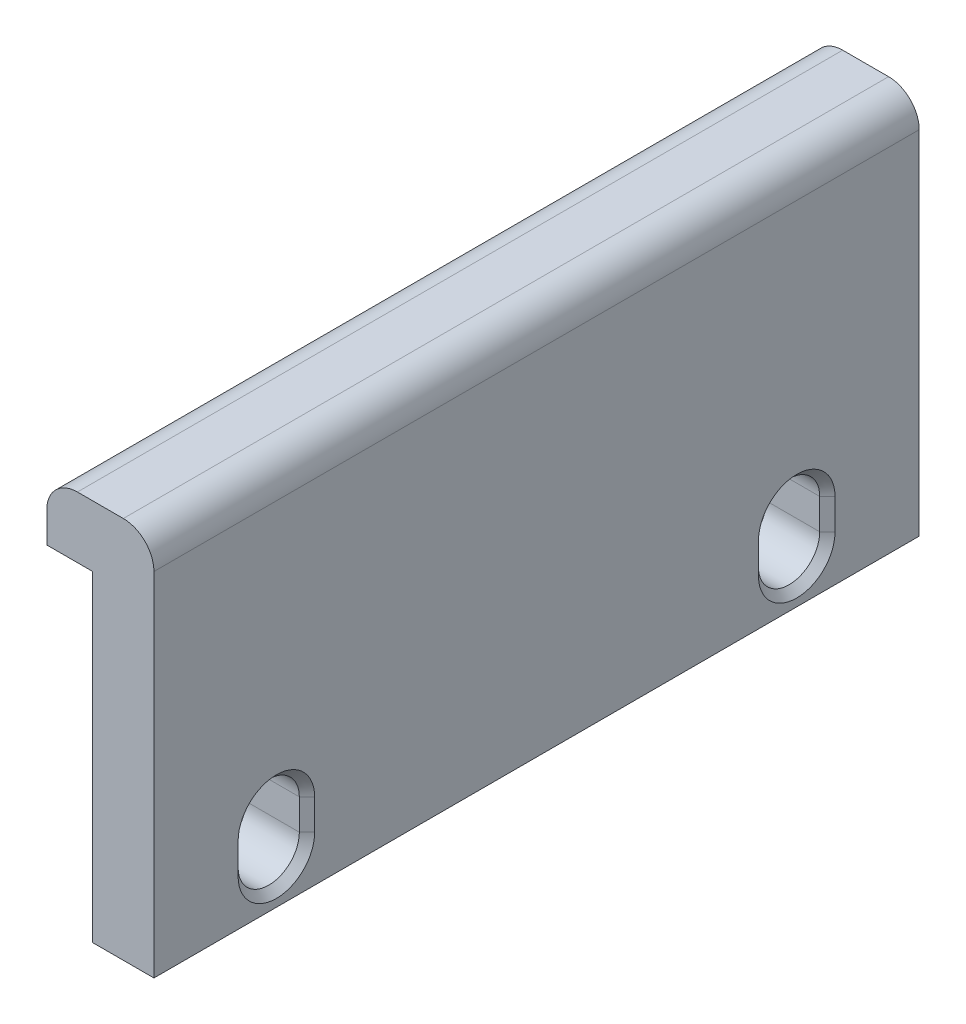
ISO-10303-21;
HEADER;
FILE_DESCRIPTION(('STEP AP214'),'2;1');
FILE_NAME('part.step','',(''),(''),'','','');
FILE_SCHEMA(('AUTOMOTIVE_DESIGN { 1 0 10303 214 1 1 1 1 }'));
ENDSEC;
DATA;
#1=APPLICATION_CONTEXT('core data for automotive mechanical design processes');
#2=APPLICATION_PROTOCOL_DEFINITION('international standard','automotive_design',2000,#1);
#3=PRODUCT_CONTEXT('',#1,'mechanical');
#4=PRODUCT('Part','Part','',(#3));
#5=PRODUCT_RELATED_PRODUCT_CATEGORY('part','',(#4));
#6=PRODUCT_DEFINITION_FORMATION('','',#4);
#7=PRODUCT_DEFINITION_CONTEXT('part definition',#1,'design');
#8=PRODUCT_DEFINITION('design','',#6,#7);
#9=PRODUCT_DEFINITION_SHAPE('','',#8);
#10=(LENGTH_UNIT() NAMED_UNIT(*) SI_UNIT(.MILLI.,.METRE.));
#11=(NAMED_UNIT(*) PLANE_ANGLE_UNIT() SI_UNIT($,.RADIAN.));
#12=(NAMED_UNIT(*) SI_UNIT($,.STERADIAN.) SOLID_ANGLE_UNIT());
#13=UNCERTAINTY_MEASURE_WITH_UNIT(LENGTH_MEASURE(1.E-05),#10,'distance_accuracy_value','');
#14=(GEOMETRIC_REPRESENTATION_CONTEXT(3) GLOBAL_UNCERTAINTY_ASSIGNED_CONTEXT((#13)) GLOBAL_UNIT_ASSIGNED_CONTEXT((#10,
#11,#12)) REPRESENTATION_CONTEXT('',''));
#15=CARTESIAN_POINT('',(0.,0.,0.));
#16=DIRECTION('',(0.,0.,1.));
#17=DIRECTION('',(1.,0.,0.));
#18=AXIS2_PLACEMENT_3D('',#15,#16,#17);
#19=CARTESIAN_POINT('',(4.,0.,50.));
#20=DIRECTION('',(-1.,0.,0.));
#21=DIRECTION('',(0.,0.,1.));
#22=AXIS2_PLACEMENT_3D('',#19,#20,#21);
#23=PLANE('',#22);
#24=DIRECTION('',(0.,1.,0.));
#25=VECTOR('',#24,1.);
#26=CARTESIAN_POINT('',(4.,5.,10.5));
#27=LINE('',#26,#25);
#28=CARTESIAN_POINT('',(4.,3.,10.5));
#29=VERTEX_POINT('',#28);
#30=CARTESIAN_POINT('',(4.,5.,10.5));
#31=VERTEX_POINT('',#30);
#32=EDGE_CURVE('E304',#29,#31,#27,.T.);
#33=ORIENTED_EDGE('',*,*,#32,.T.);
#34=CARTESIAN_POINT('',(4.,5.00000000000001,8.));
#35=DIRECTION('',(-1.,0.,0.));
#36=DIRECTION('',(0.,0.,1.));
#37=AXIS2_PLACEMENT_3D('',#34,#35,#36);
#38=CIRCLE('',#37,2.5);
#39=CARTESIAN_POINT('',(4.,5.,5.5));
#40=VERTEX_POINT('',#39);
#41=EDGE_CURVE('E308',#31,#40,#38,.T.);
#42=ORIENTED_EDGE('',*,*,#41,.T.);
#43=DIRECTION('',(0.,-1.,0.));
#44=VECTOR('',#43,1.);
#45=CARTESIAN_POINT('',(4.,0.,5.5));
#46=LINE('',#45,#44);
#47=CARTESIAN_POINT('',(4.,3.,5.5));
#48=VERTEX_POINT('',#47);
#49=EDGE_CURVE('E306',#40,#48,#46,.T.);
#50=ORIENTED_EDGE('',*,*,#49,.T.);
#51=CARTESIAN_POINT('',(4.,3.,8.));
#52=DIRECTION('',(-1.,0.,0.));
#53=DIRECTION('',(0.,0.,1.));
#54=AXIS2_PLACEMENT_3D('',#51,#52,#53);
#55=CIRCLE('',#54,2.5);
#56=EDGE_CURVE('E302',#48,#29,#55,.T.);
#57=ORIENTED_EDGE('',*,*,#56,.T.);
#58=EDGE_LOOP('',(#33,#42,#50,#57));
#59=FACE_BOUND('',#58,.T.);
#60=DIRECTION('',(0.,1.,0.));
#61=VECTOR('',#60,1.);
#62=CARTESIAN_POINT('',(4.,5.,44.5));
#63=LINE('',#62,#61);
#64=CARTESIAN_POINT('',(4.,3.,44.5));
#65=VERTEX_POINT('',#64);
#66=CARTESIAN_POINT('',(4.,4.99999999999999,44.5));
#67=VERTEX_POINT('',#66);
#68=EDGE_CURVE('E297',#65,#67,#63,.T.);
#69=ORIENTED_EDGE('',*,*,#68,.T.);
#70=CARTESIAN_POINT('',(4.,5.,42.));
#71=DIRECTION('',(-1.,0.,0.));
#72=DIRECTION('',(0.,0.,1.));
#73=AXIS2_PLACEMENT_3D('',#70,#71,#72);
#74=CIRCLE('',#73,2.5);
#75=CARTESIAN_POINT('',(4.,4.99999999999999,39.5));
#76=VERTEX_POINT('',#75);
#77=EDGE_CURVE('E299',#67,#76,#74,.T.);
#78=ORIENTED_EDGE('',*,*,#77,.T.);
#79=DIRECTION('',(0.,-1.,0.));
#80=VECTOR('',#79,1.);
#81=CARTESIAN_POINT('',(4.,0.,39.5));
#82=LINE('',#81,#80);
#83=CARTESIAN_POINT('',(4.,3.,39.5));
#84=VERTEX_POINT('',#83);
#85=EDGE_CURVE('E295',#76,#84,#82,.T.);
#86=ORIENTED_EDGE('',*,*,#85,.T.);
#87=CARTESIAN_POINT('',(4.,2.99999999999999,42.));
#88=DIRECTION('',(-1.,0.,0.));
#89=DIRECTION('',(0.,0.,1.));
#90=AXIS2_PLACEMENT_3D('',#87,#88,#89);
#91=CIRCLE('',#90,2.5);
#92=EDGE_CURVE('E293',#84,#65,#91,.T.);
#93=ORIENTED_EDGE('',*,*,#92,.T.);
#94=EDGE_LOOP('',(#69,#78,#86,#93));
#95=FACE_BOUND('',#94,.T.);
#96=DIRECTION('',(0.,1.,0.));
#97=VECTOR('',#96,1.);
#98=CARTESIAN_POINT('',(4.,0.,0.));
#99=LINE('',#98,#97);
#100=CARTESIAN_POINT('',(4.,0.,0.));
#101=VERTEX_POINT('',#100);
#102=CARTESIAN_POINT('',(4.,23.,0.));
#103=VERTEX_POINT('',#102);
#104=EDGE_CURVE('E253',#101,#103,#99,.T.);
#105=ORIENTED_EDGE('',*,*,#104,.T.);
#106=DIRECTION('',(0.,0.,-1.));
#107=VECTOR('',#106,1.);
#108=CARTESIAN_POINT('',(4.,23.,50.));
#109=LINE('',#108,#107);
#110=CARTESIAN_POINT('',(4.,23.,50.));
#111=VERTEX_POINT('',#110);
#112=EDGE_CURVE('E291',#103,#111,#109,.F.);
#113=ORIENTED_EDGE('',*,*,#112,.T.);
#114=DIRECTION('',(0.,1.,0.));
#115=VECTOR('',#114,1.);
#116=CARTESIAN_POINT('',(4.,0.,50.));
#117=LINE('',#116,#115);
#118=CARTESIAN_POINT('',(4.,0.,50.));
#119=VERTEX_POINT('',#118);
#120=EDGE_CURVE('E237',#119,#111,#117,.T.);
#121=ORIENTED_EDGE('',*,*,#120,.F.);
#122=DIRECTION('',(0.,0.,-1.));
#123=VECTOR('',#122,1.);
#124=CARTESIAN_POINT('',(4.,0.,50.));
#125=LINE('',#124,#123);
#126=EDGE_CURVE('E272',#119,#101,#125,.T.);
#127=ORIENTED_EDGE('',*,*,#126,.T.);
#128=EDGE_LOOP('',(#105,#113,#121,#127));
#129=FACE_BOUND('',#128,.T.);
#130=ADVANCED_FACE('F37',(#59,#95,#129),#23,.F.);
#131=CARTESIAN_POINT('',(0.,21.,50.));
#132=DIRECTION('',(1.,0.,0.));
#133=DIRECTION('',(0.,1.,0.));
#134=AXIS2_PLACEMENT_3D('',#131,#132,#133);
#135=PLANE('',#134);
#136=CARTESIAN_POINT('',(0.,2.99999999999999,42.));
#137=DIRECTION('',(1.,0.,0.));
#138=DIRECTION('',(0.,1.,0.));
#139=AXIS2_PLACEMENT_3D('',#136,#137,#138);
#140=CIRCLE('',#139,2.00000000000001);
#141=CARTESIAN_POINT('',(0.,3.,40.));
#142=VERTEX_POINT('',#141);
#143=CARTESIAN_POINT('',(0.,3.,44.));
#144=VERTEX_POINT('',#143);
#145=EDGE_CURVE('E200',#142,#144,#140,.F.);
#146=ORIENTED_EDGE('',*,*,#145,.F.);
#147=DIRECTION('',(0.,-1.,0.));
#148=VECTOR('',#147,1.);
#149=CARTESIAN_POINT('',(0.,0.,40.));
#150=LINE('',#149,#148);
#151=CARTESIAN_POINT('',(0.,4.99999999999999,40.));
#152=VERTEX_POINT('',#151);
#153=EDGE_CURVE('E180',#152,#142,#150,.T.);
#154=ORIENTED_EDGE('',*,*,#153,.F.);
#155=CARTESIAN_POINT('',(0.,5.,42.));
#156=DIRECTION('',(1.,0.,0.));
#157=DIRECTION('',(0.,1.,0.));
#158=AXIS2_PLACEMENT_3D('',#155,#156,#157);
#159=CIRCLE('',#158,2.00000000000001);
#160=CARTESIAN_POINT('',(0.,4.99999999999999,44.));
#161=VERTEX_POINT('',#160);
#162=EDGE_CURVE('E190',#161,#152,#159,.F.);
#163=ORIENTED_EDGE('',*,*,#162,.F.);
#164=DIRECTION('',(0.,-1.,0.));
#165=VECTOR('',#164,1.);
#166=CARTESIAN_POINT('',(0.,0.,44.));
#167=LINE('',#166,#165);
#168=EDGE_CURVE('E202',#161,#144,#167,.T.);
#169=ORIENTED_EDGE('',*,*,#168,.T.);
#170=EDGE_LOOP('',(#146,#154,#163,#169));
#171=FACE_BOUND('',#170,.T.);
#172=DIRECTION('',(0.,-1.,0.));
#173=VECTOR('',#172,1.);
#174=CARTESIAN_POINT('',(0.,21.,0.));
#175=LINE('',#174,#173);
#176=CARTESIAN_POINT('',(0.,21.,0.));
#177=VERTEX_POINT('',#176);
#178=CARTESIAN_POINT('',(0.,0.,0.));
#179=VERTEX_POINT('',#178);
#180=EDGE_CURVE('E238',#177,#179,#175,.T.);
#181=ORIENTED_EDGE('',*,*,#180,.T.);
#182=DIRECTION('',(0.,0.,-1.));
#183=VECTOR('',#182,1.);
#184=CARTESIAN_POINT('',(0.,0.,50.));
#185=LINE('',#184,#183);
#186=CARTESIAN_POINT('',(0.,0.,50.));
#187=VERTEX_POINT('',#186);
#188=EDGE_CURVE('E250',#187,#179,#185,.T.);
#189=ORIENTED_EDGE('',*,*,#188,.F.);
#190=DIRECTION('',(0.,-1.,0.));
#191=VECTOR('',#190,1.);
#192=CARTESIAN_POINT('',(0.,21.,50.));
#193=LINE('',#192,#191);
#194=CARTESIAN_POINT('',(0.,21.,50.));
#195=VERTEX_POINT('',#194);
#196=EDGE_CURVE('E248',#195,#187,#193,.T.);
#197=ORIENTED_EDGE('',*,*,#196,.F.);
#198=DIRECTION('',(0.,0.,-1.));
#199=VECTOR('',#198,1.);
#200=CARTESIAN_POINT('',(0.,21.,50.));
#201=LINE('',#200,#199);
#202=EDGE_CURVE('E266',#195,#177,#201,.T.);
#203=ORIENTED_EDGE('',*,*,#202,.T.);
#204=EDGE_LOOP('',(#181,#189,#197,#203));
#205=FACE_BOUND('',#204,.T.);
#206=CARTESIAN_POINT('',(0.,5.00000000000001,8.));
#207=DIRECTION('',(1.,0.,0.));
#208=DIRECTION('',(0.,1.,0.));
#209=AXIS2_PLACEMENT_3D('',#206,#207,#208);
#210=CIRCLE('',#209,2.);
#211=CARTESIAN_POINT('',(0.,5.,6.));
#212=VERTEX_POINT('',#211);
#213=CARTESIAN_POINT('',(0.,5.,10.));
#214=VERTEX_POINT('',#213);
#215=EDGE_CURVE('E216',#212,#214,#210,.T.);
#216=ORIENTED_EDGE('',*,*,#215,.T.);
#217=DIRECTION('',(0.,-1.,0.));
#218=VECTOR('',#217,1.);
#219=CARTESIAN_POINT('',(0.,0.,10.));
#220=LINE('',#219,#218);
#221=CARTESIAN_POINT('',(0.,3.,10.));
#222=VERTEX_POINT('',#221);
#223=EDGE_CURVE('E223',#214,#222,#220,.T.);
#224=ORIENTED_EDGE('',*,*,#223,.T.);
#225=CARTESIAN_POINT('',(0.,3.,8.));
#226=DIRECTION('',(1.,0.,0.));
#227=DIRECTION('',(0.,1.,0.));
#228=AXIS2_PLACEMENT_3D('',#225,#226,#227);
#229=CIRCLE('',#228,2.);
#230=CARTESIAN_POINT('',(0.,3.,6.));
#231=VERTEX_POINT('',#230);
#232=EDGE_CURVE('E210',#222,#231,#229,.T.);
#233=ORIENTED_EDGE('',*,*,#232,.T.);
#234=DIRECTION('',(0.,-1.,0.));
#235=VECTOR('',#234,1.);
#236=CARTESIAN_POINT('',(0.,0.,6.));
#237=LINE('',#236,#235);
#238=EDGE_CURVE('E213',#212,#231,#237,.T.);
#239=ORIENTED_EDGE('',*,*,#238,.F.);
#240=EDGE_LOOP('',(#216,#224,#233,#239));
#241=FACE_BOUND('',#240,.T.);
#242=ADVANCED_FACE('F197',(#171,#205,#241),#135,.F.);
#243=CARTESIAN_POINT('',(0.,0.,50.));
#244=DIRECTION('',(0.,1.,0.));
#245=DIRECTION('',(0.,0.,1.));
#246=AXIS2_PLACEMENT_3D('',#243,#244,#245);
#247=PLANE('',#246);
#248=DIRECTION('',(1.,0.,0.));
#249=VECTOR('',#248,1.);
#250=CARTESIAN_POINT('',(0.,0.,0.));
#251=LINE('',#250,#249);
#252=EDGE_CURVE('E194',#179,#101,#251,.T.);
#253=ORIENTED_EDGE('',*,*,#252,.T.);
#254=ORIENTED_EDGE('',*,*,#126,.F.);
#255=DIRECTION('',(1.,0.,0.));
#256=VECTOR('',#255,1.);
#257=CARTESIAN_POINT('',(0.,0.,50.));
#258=LINE('',#257,#256);
#259=EDGE_CURVE('E234',#187,#119,#258,.T.);
#260=ORIENTED_EDGE('',*,*,#259,.F.);
#261=ORIENTED_EDGE('',*,*,#188,.T.);
#262=EDGE_LOOP('',(#253,#254,#260,#261));
#263=FACE_BOUND('',#262,.T.);
#264=ADVANCED_FACE('F373',(#263),#247,.F.);
#265=CARTESIAN_POINT('',(4.,25.,50.));
#266=DIRECTION('',(0.,-1.,0.));
#267=DIRECTION('',(0.,0.,-1.));
#268=AXIS2_PLACEMENT_3D('',#265,#266,#267);
#269=PLANE('',#268);
#270=DIRECTION('',(-1.,0.,0.));
#271=VECTOR('',#270,1.);
#272=CARTESIAN_POINT('',(4.,25.,0.));
#273=LINE('',#272,#271);
#274=CARTESIAN_POINT('',(2.,25.,0.));
#275=VERTEX_POINT('',#274);
#276=CARTESIAN_POINT('',(-1.,25.,0.));
#277=VERTEX_POINT('',#276);
#278=EDGE_CURVE('E256',#275,#277,#273,.T.);
#279=ORIENTED_EDGE('',*,*,#278,.T.);
#280=DIRECTION('',(0.,0.,-1.));
#281=VECTOR('',#280,1.);
#282=CARTESIAN_POINT('',(-1.,25.,50.));
#283=LINE('',#282,#281);
#284=CARTESIAN_POINT('',(-1.,25.,50.));
#285=VERTEX_POINT('',#284);
#286=EDGE_CURVE('E285',#277,#285,#283,.F.);
#287=ORIENTED_EDGE('',*,*,#286,.T.);
#288=DIRECTION('',(-1.,0.,0.));
#289=VECTOR('',#288,1.);
#290=CARTESIAN_POINT('',(4.,25.,50.));
#291=LINE('',#290,#289);
#292=CARTESIAN_POINT('',(2.,25.,50.));
#293=VERTEX_POINT('',#292);
#294=EDGE_CURVE('E241',#293,#285,#291,.T.);
#295=ORIENTED_EDGE('',*,*,#294,.F.);
#296=DIRECTION('',(0.,0.,-1.));
#297=VECTOR('',#296,1.);
#298=CARTESIAN_POINT('',(2.,25.,50.));
#299=LINE('',#298,#297);
#300=EDGE_CURVE('E282',#293,#275,#299,.T.);
#301=ORIENTED_EDGE('',*,*,#300,.T.);
#302=EDGE_LOOP('',(#279,#287,#295,#301));
#303=FACE_BOUND('',#302,.T.);
#304=ADVANCED_FACE('F377',(#303),#269,.F.);
#305=CARTESIAN_POINT('',(-3.,25.,50.));
#306=DIRECTION('',(1.,0.,0.));
#307=DIRECTION('',(0.,1.,0.));
#308=AXIS2_PLACEMENT_3D('',#305,#306,#307);
#309=PLANE('',#308);
#310=DIRECTION('',(0.,-1.,0.));
#311=VECTOR('',#310,1.);
#312=CARTESIAN_POINT('',(-3.,25.,50.));
#313=LINE('',#312,#311);
#314=CARTESIAN_POINT('',(-3.,23.,50.));
#315=VERTEX_POINT('',#314);
#316=CARTESIAN_POINT('',(-3.,21.,50.));
#317=VERTEX_POINT('',#316);
#318=EDGE_CURVE('E244',#315,#317,#313,.T.);
#319=ORIENTED_EDGE('',*,*,#318,.F.);
#320=DIRECTION('',(0.,0.,-1.));
#321=VECTOR('',#320,1.);
#322=CARTESIAN_POINT('',(-3.,23.,50.));
#323=LINE('',#322,#321);
#324=CARTESIAN_POINT('',(-3.,23.,0.));
#325=VERTEX_POINT('',#324);
#326=EDGE_CURVE('E275',#315,#325,#323,.T.);
#327=ORIENTED_EDGE('',*,*,#326,.T.);
#328=DIRECTION('',(0.,-1.,0.));
#329=VECTOR('',#328,1.);
#330=CARTESIAN_POINT('',(-3.,25.,0.));
#331=LINE('',#330,#329);
#332=CARTESIAN_POINT('',(-3.,21.,0.));
#333=VERTEX_POINT('',#332);
#334=EDGE_CURVE('E259',#325,#333,#331,.T.);
#335=ORIENTED_EDGE('',*,*,#334,.T.);
#336=DIRECTION('',(0.,0.,-1.));
#337=VECTOR('',#336,1.);
#338=CARTESIAN_POINT('',(-3.,21.,50.));
#339=LINE('',#338,#337);
#340=EDGE_CURVE('E269',#317,#333,#339,.T.);
#341=ORIENTED_EDGE('',*,*,#340,.F.);
#342=EDGE_LOOP('',(#319,#327,#335,#341));
#343=FACE_BOUND('',#342,.T.);
#344=ADVANCED_FACE('F561',(#343),#309,.F.);
#345=CARTESIAN_POINT('',(-3.,21.,50.));
#346=DIRECTION('',(0.,1.,0.));
#347=DIRECTION('',(-1.,0.,0.));
#348=AXIS2_PLACEMENT_3D('',#345,#346,#347);
#349=PLANE('',#348);
#350=DIRECTION('',(1.,0.,0.));
#351=VECTOR('',#350,1.);
#352=CARTESIAN_POINT('',(-3.,21.,0.));
#353=LINE('',#352,#351);
#354=EDGE_CURVE('E261',#333,#177,#353,.T.);
#355=ORIENTED_EDGE('',*,*,#354,.T.);
#356=ORIENTED_EDGE('',*,*,#202,.F.);
#357=DIRECTION('',(1.,0.,0.));
#358=VECTOR('',#357,1.);
#359=CARTESIAN_POINT('',(-3.,21.,50.));
#360=LINE('',#359,#358);
#361=EDGE_CURVE('E246',#317,#195,#360,.T.);
#362=ORIENTED_EDGE('',*,*,#361,.F.);
#363=ORIENTED_EDGE('',*,*,#340,.T.);
#364=EDGE_LOOP('',(#355,#356,#362,#363));
#365=FACE_BOUND('',#364,.T.);
#366=ADVANCED_FACE('F553',(#365),#349,.F.);
#367=CARTESIAN_POINT('',(0.,0.,50.));
#368=DIRECTION('',(0.,0.,1.));
#369=DIRECTION('',(1.,0.,0.));
#370=AXIS2_PLACEMENT_3D('',#367,#368,#369);
#371=PLANE('',#370);
#372=ORIENTED_EDGE('',*,*,#294,.T.);
#373=CARTESIAN_POINT('',(-1.,23.,50.));
#374=DIRECTION('',(0.,0.,1.));
#375=DIRECTION('',(1.,0.,0.));
#376=AXIS2_PLACEMENT_3D('',#373,#374,#375);
#377=CIRCLE('',#376,2.);
#378=EDGE_CURVE('E289',#285,#315,#377,.T.);
#379=ORIENTED_EDGE('',*,*,#378,.T.);
#380=ORIENTED_EDGE('',*,*,#318,.T.);
#381=ORIENTED_EDGE('',*,*,#361,.T.);
#382=ORIENTED_EDGE('',*,*,#196,.T.);
#383=ORIENTED_EDGE('',*,*,#259,.T.);
#384=ORIENTED_EDGE('',*,*,#120,.T.);
#385=CARTESIAN_POINT('',(2.,23.,50.));
#386=DIRECTION('',(0.,0.,1.));
#387=DIRECTION('',(1.,0.,0.));
#388=AXIS2_PLACEMENT_3D('',#385,#386,#387);
#389=CIRCLE('',#388,2.);
#390=EDGE_CURVE('E287',#111,#293,#389,.T.);
#391=ORIENTED_EDGE('',*,*,#390,.T.);
#392=EDGE_LOOP('',(#372,#379,#380,#381,#382,#383,#384,#391));
#393=FACE_BOUND('',#392,.T.);
#394=ADVANCED_FACE('F543',(#393),#371,.T.);
#395=CARTESIAN_POINT('',(0.,0.,0.));
#396=DIRECTION('',(0.,0.,1.));
#397=DIRECTION('',(1.,0.,0.));
#398=AXIS2_PLACEMENT_3D('',#395,#396,#397);
#399=PLANE('',#398);
#400=ORIENTED_EDGE('',*,*,#334,.F.);
#401=CARTESIAN_POINT('',(-1.,23.,0.));
#402=DIRECTION('',(0.,0.,1.));
#403=DIRECTION('',(1.,0.,0.));
#404=AXIS2_PLACEMENT_3D('',#401,#402,#403);
#405=CIRCLE('',#404,2.);
#406=EDGE_CURVE('E280',#325,#277,#405,.F.);
#407=ORIENTED_EDGE('',*,*,#406,.T.);
#408=ORIENTED_EDGE('',*,*,#278,.F.);
#409=CARTESIAN_POINT('',(2.,23.,0.));
#410=DIRECTION('',(0.,0.,1.));
#411=DIRECTION('',(1.,0.,0.));
#412=AXIS2_PLACEMENT_3D('',#409,#410,#411);
#413=CIRCLE('',#412,2.);
#414=EDGE_CURVE('E278',#275,#103,#413,.F.);
#415=ORIENTED_EDGE('',*,*,#414,.T.);
#416=ORIENTED_EDGE('',*,*,#104,.F.);
#417=ORIENTED_EDGE('',*,*,#252,.F.);
#418=ORIENTED_EDGE('',*,*,#180,.F.);
#419=ORIENTED_EDGE('',*,*,#354,.F.);
#420=EDGE_LOOP('',(#400,#407,#408,#415,#416,#417,#418,#419));
#421=FACE_BOUND('',#420,.T.);
#422=ADVANCED_FACE('F386',(#421),#399,.F.);
#423=CARTESIAN_POINT('',(-1.,23.,50.));
#424=DIRECTION('',(0.,0.,-1.));
#425=DIRECTION('',(-1.,0.,0.));
#426=AXIS2_PLACEMENT_3D('',#423,#424,#425);
#427=CYLINDRICAL_SURFACE('',#426,2.);
#428=ORIENTED_EDGE('',*,*,#378,.F.);
#429=ORIENTED_EDGE('',*,*,#286,.F.);
#430=ORIENTED_EDGE('',*,*,#406,.F.);
#431=ORIENTED_EDGE('',*,*,#326,.F.);
#432=EDGE_LOOP('',(#428,#429,#430,#431));
#433=FACE_BOUND('',#432,.T.);
#434=ADVANCED_FACE('F382',(#433),#427,.T.);
#435=CARTESIAN_POINT('',(2.,23.,50.));
#436=DIRECTION('',(0.,0.,-1.));
#437=DIRECTION('',(-1.,0.,0.));
#438=AXIS2_PLACEMENT_3D('',#435,#436,#437);
#439=CYLINDRICAL_SURFACE('',#438,2.);
#440=ORIENTED_EDGE('',*,*,#390,.F.);
#441=ORIENTED_EDGE('',*,*,#112,.F.);
#442=ORIENTED_EDGE('',*,*,#414,.F.);
#443=ORIENTED_EDGE('',*,*,#300,.F.);
#444=EDGE_LOOP('',(#440,#441,#442,#443));
#445=FACE_BOUND('',#444,.T.);
#446=ADVANCED_FACE('F385',(#445),#439,.T.);
#447=CARTESIAN_POINT('',(-3.001,5.00000000000001,8.));
#448=DIRECTION('',(1.,0.,0.));
#449=DIRECTION('',(0.,1.,0.));
#450=AXIS2_PLACEMENT_3D('',#447,#448,#449);
#451=CYLINDRICAL_SURFACE('',#450,2.);
#452=DIRECTION('',(1.,0.,0.));
#453=VECTOR('',#452,1.);
#454=CARTESIAN_POINT('',(-3.001,5.,6.));
#455=LINE('',#454,#453);
#456=CARTESIAN_POINT('',(3.5,5.,6.));
#457=VERTEX_POINT('',#456);
#458=EDGE_CURVE('E220',#212,#457,#455,.T.);
#459=ORIENTED_EDGE('',*,*,#458,.T.);
#460=CARTESIAN_POINT('',(3.5,5.00000000000001,8.));
#461=DIRECTION('',(-1.,0.,0.));
#462=DIRECTION('',(0.,0.,1.));
#463=AXIS2_PLACEMENT_3D('',#460,#461,#462);
#464=CIRCLE('',#463,2.);
#465=CARTESIAN_POINT('',(3.5,5.,10.));
#466=VERTEX_POINT('',#465);
#467=EDGE_CURVE('E311',#457,#466,#464,.F.);
#468=ORIENTED_EDGE('',*,*,#467,.T.);
#469=DIRECTION('',(1.,0.,0.));
#470=VECTOR('',#469,1.);
#471=CARTESIAN_POINT('',(-3.001,5.,10.));
#472=LINE('',#471,#470);
#473=EDGE_CURVE('E219',#214,#466,#472,.T.);
#474=ORIENTED_EDGE('',*,*,#473,.F.);
#475=ORIENTED_EDGE('',*,*,#215,.F.);
#476=EDGE_LOOP('',(#459,#468,#474,#475));
#477=FACE_BOUND('',#476,.T.);
#478=ADVANCED_FACE('F390',(#477),#451,.F.);
#479=CARTESIAN_POINT('',(-3.001,0.,6.));
#480=DIRECTION('',(0.,0.,-1.));
#481=DIRECTION('',(-1.,0.,0.));
#482=AXIS2_PLACEMENT_3D('',#479,#480,#481);
#483=PLANE('',#482);
#484=DIRECTION('',(1.,0.,0.));
#485=VECTOR('',#484,1.);
#486=CARTESIAN_POINT('',(-3.001,3.,6.));
#487=LINE('',#486,#485);
#488=CARTESIAN_POINT('',(3.5,3.,6.));
#489=VERTEX_POINT('',#488);
#490=EDGE_CURVE('E224',#231,#489,#487,.T.);
#491=ORIENTED_EDGE('',*,*,#490,.T.);
#492=DIRECTION('',(0.,1.,0.));
#493=VECTOR('',#492,1.);
#494=CARTESIAN_POINT('',(3.5,0.,6.));
#495=LINE('',#494,#493);
#496=EDGE_CURVE('E314',#489,#457,#495,.T.);
#497=ORIENTED_EDGE('',*,*,#496,.T.);
#498=ORIENTED_EDGE('',*,*,#458,.F.);
#499=ORIENTED_EDGE('',*,*,#238,.T.);
#500=EDGE_LOOP('',(#491,#497,#498,#499));
#501=FACE_BOUND('',#500,.T.);
#502=ADVANCED_FACE('F493',(#501),#483,.F.);
#503=CARTESIAN_POINT('',(-3.001,3.,8.));
#504=DIRECTION('',(1.,0.,0.));
#505=DIRECTION('',(0.,1.,0.));
#506=AXIS2_PLACEMENT_3D('',#503,#504,#505);
#507=CYLINDRICAL_SURFACE('',#506,2.);
#508=DIRECTION('',(1.,0.,0.));
#509=VECTOR('',#508,1.);
#510=CARTESIAN_POINT('',(-3.001,3.,10.));
#511=LINE('',#510,#509);
#512=CARTESIAN_POINT('',(3.5,3.,10.));
#513=VERTEX_POINT('',#512);
#514=EDGE_CURVE('E227',#222,#513,#511,.T.);
#515=ORIENTED_EDGE('',*,*,#514,.T.);
#516=CARTESIAN_POINT('',(3.5,3.,8.));
#517=DIRECTION('',(-1.,0.,0.));
#518=DIRECTION('',(0.,0.,1.));
#519=AXIS2_PLACEMENT_3D('',#516,#517,#518);
#520=CIRCLE('',#519,2.);
#521=EDGE_CURVE('E318',#513,#489,#520,.F.);
#522=ORIENTED_EDGE('',*,*,#521,.T.);
#523=ORIENTED_EDGE('',*,*,#490,.F.);
#524=ORIENTED_EDGE('',*,*,#232,.F.);
#525=EDGE_LOOP('',(#515,#522,#523,#524));
#526=FACE_BOUND('',#525,.T.);
#527=ADVANCED_FACE('F483',(#526),#507,.F.);
#528=CARTESIAN_POINT('',(-3.001,0.,10.));
#529=DIRECTION('',(0.,0.,-1.));
#530=DIRECTION('',(-1.,0.,0.));
#531=AXIS2_PLACEMENT_3D('',#528,#529,#530);
#532=PLANE('',#531);
#533=ORIENTED_EDGE('',*,*,#473,.T.);
#534=DIRECTION('',(0.,-1.,0.));
#535=VECTOR('',#534,1.);
#536=CARTESIAN_POINT('',(3.5,3.,10.));
#537=LINE('',#536,#535);
#538=EDGE_CURVE('E316',#466,#513,#537,.T.);
#539=ORIENTED_EDGE('',*,*,#538,.T.);
#540=ORIENTED_EDGE('',*,*,#514,.F.);
#541=ORIENTED_EDGE('',*,*,#223,.F.);
#542=EDGE_LOOP('',(#533,#539,#540,#541));
#543=FACE_BOUND('',#542,.T.);
#544=ADVANCED_FACE('F365',(#543),#532,.T.);
#545=CARTESIAN_POINT('',(-3.001,0.,40.));
#546=DIRECTION('',(0.,0.,-1.));
#547=DIRECTION('',(-1.,0.,0.));
#548=AXIS2_PLACEMENT_3D('',#545,#546,#547);
#549=PLANE('',#548);
#550=DIRECTION('',(1.,0.,0.));
#551=VECTOR('',#550,1.);
#552=CARTESIAN_POINT('',(-3.001,3.,40.));
#553=LINE('',#552,#551);
#554=CARTESIAN_POINT('',(3.5,3.,40.));
#555=VERTEX_POINT('',#554);
#556=EDGE_CURVE('E195',#142,#555,#553,.T.);
#557=ORIENTED_EDGE('',*,*,#556,.T.);
#558=DIRECTION('',(0.,1.,0.));
#559=VECTOR('',#558,1.);
#560=CARTESIAN_POINT('',(3.5,0.,40.));
#561=LINE('',#560,#559);
#562=CARTESIAN_POINT('',(3.5,4.99999999999999,40.));
#563=VERTEX_POINT('',#562);
#564=EDGE_CURVE('E47',#555,#563,#561,.T.);
#565=ORIENTED_EDGE('',*,*,#564,.T.);
#566=DIRECTION('',(1.,0.,0.));
#567=VECTOR('',#566,1.);
#568=CARTESIAN_POINT('',(-3.001,4.99999999999999,40.));
#569=LINE('',#568,#567);
#570=EDGE_CURVE('E176',#152,#563,#569,.T.);
#571=ORIENTED_EDGE('',*,*,#570,.F.);
#572=ORIENTED_EDGE('',*,*,#153,.T.);
#573=EDGE_LOOP('',(#557,#565,#571,#572));
#574=FACE_BOUND('',#573,.T.);
#575=ADVANCED_FACE('F178',(#574),#549,.F.);
#576=CARTESIAN_POINT('',(-3.001,2.99999999999999,42.));
#577=DIRECTION('',(1.,0.,0.));
#578=DIRECTION('',(0.,1.,0.));
#579=AXIS2_PLACEMENT_3D('',#576,#577,#578);
#580=CYLINDRICAL_SURFACE('',#579,2.00000000000001);
#581=DIRECTION('',(1.,0.,0.));
#582=VECTOR('',#581,1.);
#583=CARTESIAN_POINT('',(-3.001,2.99999999999999,44.));
#584=LINE('',#583,#582);
#585=CARTESIAN_POINT('',(3.5,3.,44.));
#586=VERTEX_POINT('',#585);
#587=EDGE_CURVE('E207',#144,#586,#584,.T.);
#588=ORIENTED_EDGE('',*,*,#587,.T.);
#589=CARTESIAN_POINT('',(3.5,2.99999999999999,42.));
#590=DIRECTION('',(-1.,0.,0.));
#591=DIRECTION('',(0.,0.,1.));
#592=AXIS2_PLACEMENT_3D('',#589,#590,#591);
#593=CIRCLE('',#592,2.00000000000001);
#594=EDGE_CURVE('E11',#586,#555,#593,.F.);
#595=ORIENTED_EDGE('',*,*,#594,.T.);
#596=ORIENTED_EDGE('',*,*,#556,.F.);
#597=ORIENTED_EDGE('',*,*,#145,.T.);
#598=EDGE_LOOP('',(#588,#595,#596,#597));
#599=FACE_BOUND('',#598,.T.);
#600=ADVANCED_FACE('F357',(#599),#580,.F.);
#601=CARTESIAN_POINT('',(-3.001,0.,44.));
#602=DIRECTION('',(0.,0.,-1.));
#603=DIRECTION('',(-1.,0.,0.));
#604=AXIS2_PLACEMENT_3D('',#601,#602,#603);
#605=PLANE('',#604);
#606=DIRECTION('',(1.,0.,0.));
#607=VECTOR('',#606,1.);
#608=CARTESIAN_POINT('',(-3.001,4.99999999999999,44.));
#609=LINE('',#608,#607);
#610=CARTESIAN_POINT('',(3.5,5.,44.));
#611=VERTEX_POINT('',#610);
#612=EDGE_CURVE('E186',#161,#611,#609,.T.);
#613=ORIENTED_EDGE('',*,*,#612,.T.);
#614=DIRECTION('',(0.,-1.,0.));
#615=VECTOR('',#614,1.);
#616=CARTESIAN_POINT('',(3.5,3.,44.));
#617=LINE('',#616,#615);
#618=EDGE_CURVE('E61',#611,#586,#617,.T.);
#619=ORIENTED_EDGE('',*,*,#618,.T.);
#620=ORIENTED_EDGE('',*,*,#587,.F.);
#621=ORIENTED_EDGE('',*,*,#168,.F.);
#622=EDGE_LOOP('',(#613,#619,#620,#621));
#623=FACE_BOUND('',#622,.T.);
#624=ADVANCED_FACE('F356',(#623),#605,.T.);
#625=CARTESIAN_POINT('',(-3.001,5.,42.));
#626=DIRECTION('',(1.,0.,0.));
#627=DIRECTION('',(0.,1.,0.));
#628=AXIS2_PLACEMENT_3D('',#625,#626,#627);
#629=CYLINDRICAL_SURFACE('',#628,2.00000000000001);
#630=ORIENTED_EDGE('',*,*,#570,.T.);
#631=CARTESIAN_POINT('',(3.5,5.,42.));
#632=DIRECTION('',(-1.,0.,0.));
#633=DIRECTION('',(0.,0.,1.));
#634=AXIS2_PLACEMENT_3D('',#631,#632,#633);
#635=CIRCLE('',#634,2.00000000000001);
#636=EDGE_CURVE('E320',#563,#611,#635,.F.);
#637=ORIENTED_EDGE('',*,*,#636,.T.);
#638=ORIENTED_EDGE('',*,*,#612,.F.);
#639=ORIENTED_EDGE('',*,*,#162,.T.);
#640=EDGE_LOOP('',(#630,#637,#638,#639));
#641=FACE_BOUND('',#640,.T.);
#642=ADVANCED_FACE('F191',(#641),#629,.F.);
#643=CARTESIAN_POINT('',(4.,3.,8.));
#644=DIRECTION('',(1.,0.,0.));
#645=DIRECTION('',(0.,0.,-1.));
#646=AXIS2_PLACEMENT_3D('',#643,#644,#645);
#647=CONICAL_SURFACE('',#646,2.5,0.785398163397448);
#648=DIRECTION('',(0.707106781186548,0.,-0.707106781186548));
#649=VECTOR('',#648,1.);
#650=CARTESIAN_POINT('',(3.5,3.,6.));
#651=LINE('',#650,#649);
#652=EDGE_CURVE('E328',#489,#48,#651,.T.);
#653=ORIENTED_EDGE('',*,*,#652,.F.);
#654=ORIENTED_EDGE('',*,*,#521,.F.);
#655=DIRECTION('',(-0.707106781186548,0.,-0.707106781186548));
#656=VECTOR('',#655,1.);
#657=CARTESIAN_POINT('',(4.,3.,10.5));
#658=LINE('',#657,#656);
#659=EDGE_CURVE('E214',#29,#513,#658,.T.);
#660=ORIENTED_EDGE('',*,*,#659,.F.);
#661=ORIENTED_EDGE('',*,*,#56,.F.);
#662=EDGE_LOOP('',(#653,#654,#660,#661));
#663=FACE_BOUND('',#662,.T.);
#664=ADVANCED_FACE('F413',(#663),#647,.F.);
#665=CARTESIAN_POINT('',(4.,0.,10.5));
#666=DIRECTION('',(0.707106781186546,0.,-0.707106781186549));
#667=DIRECTION('',(0.,-1.,0.));
#668=AXIS2_PLACEMENT_3D('',#665,#666,#667);
#669=PLANE('',#668);
#670=ORIENTED_EDGE('',*,*,#659,.T.);
#671=ORIENTED_EDGE('',*,*,#538,.F.);
#672=DIRECTION('',(-0.707106781186549,0.,-0.707106781186546));
#673=VECTOR('',#672,1.);
#674=CARTESIAN_POINT('',(4.,5.,10.5));
#675=LINE('',#674,#673);
#676=EDGE_CURVE('E326',#31,#466,#675,.T.);
#677=ORIENTED_EDGE('',*,*,#676,.F.);
#678=ORIENTED_EDGE('',*,*,#32,.F.);
#679=EDGE_LOOP('',(#670,#671,#677,#678));
#680=FACE_BOUND('',#679,.T.);
#681=ADVANCED_FACE('F406',(#680),#669,.T.);
#682=CARTESIAN_POINT('',(3.5,0.,6.));
#683=DIRECTION('',(-0.707106781186549,0.,-0.707106781186546));
#684=DIRECTION('',(0.,1.,0.));
#685=AXIS2_PLACEMENT_3D('',#682,#683,#684);
#686=PLANE('',#685);
#687=ORIENTED_EDGE('',*,*,#652,.T.);
#688=ORIENTED_EDGE('',*,*,#49,.F.);
#689=DIRECTION('',(0.707106781186546,0.,-0.707106781186549));
#690=VECTOR('',#689,1.);
#691=CARTESIAN_POINT('',(3.5,5.,6.));
#692=LINE('',#691,#690);
#693=EDGE_CURVE('E324',#457,#40,#692,.T.);
#694=ORIENTED_EDGE('',*,*,#693,.F.);
#695=ORIENTED_EDGE('',*,*,#496,.F.);
#696=EDGE_LOOP('',(#687,#688,#694,#695));
#697=FACE_BOUND('',#696,.T.);
#698=ADVANCED_FACE('F399',(#697),#686,.F.);
#699=CARTESIAN_POINT('',(4.,5.00000000000001,8.));
#700=DIRECTION('',(1.,0.,0.));
#701=DIRECTION('',(0.,0.,-1.));
#702=AXIS2_PLACEMENT_3D('',#699,#700,#701);
#703=CONICAL_SURFACE('',#702,2.5,0.785398163397447);
#704=ORIENTED_EDGE('',*,*,#676,.T.);
#705=ORIENTED_EDGE('',*,*,#467,.F.);
#706=ORIENTED_EDGE('',*,*,#693,.T.);
#707=ORIENTED_EDGE('',*,*,#41,.F.);
#708=EDGE_LOOP('',(#704,#705,#706,#707));
#709=FACE_BOUND('',#708,.T.);
#710=ADVANCED_FACE('F393',(#709),#703,.F.);
#711=CARTESIAN_POINT('',(3.5,2.99999999999999,42.));
#712=DIRECTION('',(1.,0.,0.));
#713=DIRECTION('',(0.,0.,-1.));
#714=AXIS2_PLACEMENT_3D('',#711,#712,#713);
#715=CONICAL_SURFACE('',#714,2.00000000000001,0.785398163397448);
#716=DIRECTION('',(-0.707106781186545,0.,-0.70710678118655));
#717=VECTOR('',#716,1.);
#718=CARTESIAN_POINT('',(4.,3.,44.5));
#719=LINE('',#718,#717);
#720=EDGE_CURVE('E336',#65,#586,#719,.T.);
#721=ORIENTED_EDGE('',*,*,#720,.F.);
#722=ORIENTED_EDGE('',*,*,#92,.F.);
#723=DIRECTION('',(0.70710678118655,0.,-0.707106781186545));
#724=VECTOR('',#723,1.);
#725=CARTESIAN_POINT('',(3.5,3.,40.));
#726=LINE('',#725,#724);
#727=EDGE_CURVE('E42',#555,#84,#726,.T.);
#728=ORIENTED_EDGE('',*,*,#727,.F.);
#729=ORIENTED_EDGE('',*,*,#594,.F.);
#730=EDGE_LOOP('',(#721,#722,#728,#729));
#731=FACE_BOUND('',#730,.T.);
#732=ADVANCED_FACE('F40',(#731),#715,.F.);
#733=CARTESIAN_POINT('',(3.5,0.,40.));
#734=DIRECTION('',(-0.70710678118655,0.,-0.707106781186545));
#735=DIRECTION('',(0.,1.,0.));
#736=AXIS2_PLACEMENT_3D('',#733,#734,#735);
#737=PLANE('',#736);
#738=ORIENTED_EDGE('',*,*,#727,.T.);
#739=ORIENTED_EDGE('',*,*,#85,.F.);
#740=DIRECTION('',(0.707106781186545,0.,-0.70710678118655));
#741=VECTOR('',#740,1.);
#742=CARTESIAN_POINT('',(3.5,4.99999999999999,40.));
#743=LINE('',#742,#741);
#744=EDGE_CURVE('E335',#563,#76,#743,.T.);
#745=ORIENTED_EDGE('',*,*,#744,.F.);
#746=ORIENTED_EDGE('',*,*,#564,.F.);
#747=EDGE_LOOP('',(#738,#739,#745,#746));
#748=FACE_BOUND('',#747,.T.);
#749=ADVANCED_FACE('F345',(#748),#737,.F.);
#750=CARTESIAN_POINT('',(4.,0.,44.5));
#751=DIRECTION('',(0.70710678118655,0.,-0.707106781186545));
#752=DIRECTION('',(0.,-1.,0.));
#753=AXIS2_PLACEMENT_3D('',#750,#751,#752);
#754=PLANE('',#753);
#755=ORIENTED_EDGE('',*,*,#720,.T.);
#756=ORIENTED_EDGE('',*,*,#618,.F.);
#757=DIRECTION('',(-0.707106781186545,0.,-0.70710678118655));
#758=VECTOR('',#757,1.);
#759=CARTESIAN_POINT('',(4.,4.99999999999999,44.5));
#760=LINE('',#759,#758);
#761=EDGE_CURVE('E333',#67,#611,#760,.T.);
#762=ORIENTED_EDGE('',*,*,#761,.F.);
#763=ORIENTED_EDGE('',*,*,#68,.F.);
#764=EDGE_LOOP('',(#755,#756,#762,#763));
#765=FACE_BOUND('',#764,.T.);
#766=ADVANCED_FACE('F355',(#765),#754,.T.);
#767=CARTESIAN_POINT('',(3.5,5.,42.));
#768=DIRECTION('',(1.,0.,0.));
#769=DIRECTION('',(0.,0.,-1.));
#770=AXIS2_PLACEMENT_3D('',#767,#768,#769);
#771=CONICAL_SURFACE('',#770,2.00000000000001,0.785398163397447);
#772=ORIENTED_EDGE('',*,*,#744,.T.);
#773=ORIENTED_EDGE('',*,*,#77,.F.);
#774=ORIENTED_EDGE('',*,*,#761,.T.);
#775=ORIENTED_EDGE('',*,*,#636,.F.);
#776=EDGE_LOOP('',(#772,#773,#774,#775));
#777=FACE_BOUND('',#776,.T.);
#778=ADVANCED_FACE('F353',(#777),#771,.F.);
#779=CLOSED_SHELL('',(#130,#242,#264,#304,#344,#366,#394,#422,#434,#446,#478,#502,#527,#544,
#575,#600,#624,#642,#664,#681,#698,#710,#732,#749,#766,#778));
#780=MANIFOLD_SOLID_BREP('B2',#779);
#781=ADVANCED_BREP_SHAPE_REPRESENTATION('',(#18,#780),#14);
#782=SHAPE_DEFINITION_REPRESENTATION(#9,#781);
ENDSEC;
END-ISO-10303-21;
